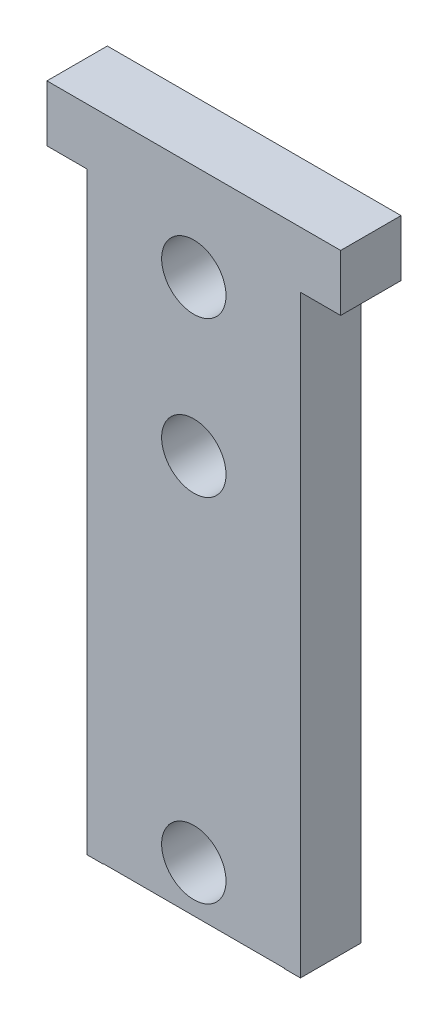
ISO-10303-21;
HEADER;
FILE_DESCRIPTION(('STEP AP214'),'2;1');
FILE_NAME('part.step','',(''),(''),'','','');
FILE_SCHEMA(('AUTOMOTIVE_DESIGN { 1 0 10303 214 1 1 1 1 }'));
ENDSEC;
DATA;
#1=APPLICATION_CONTEXT('core data for automotive mechanical design processes');
#2=APPLICATION_PROTOCOL_DEFINITION('international standard','automotive_design',2000,#1);
#3=PRODUCT_CONTEXT('',#1,'mechanical');
#4=PRODUCT('Part','Part','',(#3));
#5=PRODUCT_RELATED_PRODUCT_CATEGORY('part','',(#4));
#6=PRODUCT_DEFINITION_FORMATION('','',#4);
#7=PRODUCT_DEFINITION_CONTEXT('part definition',#1,'design');
#8=PRODUCT_DEFINITION('design','',#6,#7);
#9=PRODUCT_DEFINITION_SHAPE('','',#8);
#10=(LENGTH_UNIT() NAMED_UNIT(*) SI_UNIT(.MILLI.,.METRE.));
#11=(NAMED_UNIT(*) PLANE_ANGLE_UNIT() SI_UNIT($,.RADIAN.));
#12=(NAMED_UNIT(*) SI_UNIT($,.STERADIAN.) SOLID_ANGLE_UNIT());
#13=UNCERTAINTY_MEASURE_WITH_UNIT(LENGTH_MEASURE(1.E-05),#10,'distance_accuracy_value','');
#14=(GEOMETRIC_REPRESENTATION_CONTEXT(3) GLOBAL_UNCERTAINTY_ASSIGNED_CONTEXT((#13)) GLOBAL_UNIT_ASSIGNED_CONTEXT((#10,
#11,#12)) REPRESENTATION_CONTEXT('',''));
#15=CARTESIAN_POINT('',(0.,0.,0.));
#16=DIRECTION('',(0.,0.,1.));
#17=DIRECTION('',(1.,0.,0.));
#18=AXIS2_PLACEMENT_3D('',#15,#16,#17);
#19=CARTESIAN_POINT('',(-6.5,0.,-7.));
#20=DIRECTION('',(-1.,0.,0.));
#21=DIRECTION('',(0.,0.,1.));
#22=AXIS2_PLACEMENT_3D('',#19,#20,#21);
#23=PLANE('',#22);
#24=DIRECTION('',(0.,-1.,0.));
#25=VECTOR('',#24,1.);
#26=CARTESIAN_POINT('',(-6.5,0.,3.));
#27=LINE('',#26,#25);
#28=CARTESIAN_POINT('',(-6.5,13.2507494956604,3.));
#29=VERTEX_POINT('',#28);
#30=CARTESIAN_POINT('',(-6.5,13.25,3.));
#31=VERTEX_POINT('',#30);
#32=EDGE_CURVE('E303',#29,#31,#27,.T.);
#33=ORIENTED_EDGE('',*,*,#32,.F.);
#34=DIRECTION('',(0.,0.,1.));
#35=VECTOR('',#34,1.);
#36=CARTESIAN_POINT('',(-6.5,13.2507494956604,0.));
#37=LINE('',#36,#35);
#38=CARTESIAN_POINT('',(-6.5,13.2507494956604,0.));
#39=VERTEX_POINT('',#38);
#40=EDGE_CURVE('E223',#39,#29,#37,.T.);
#41=ORIENTED_EDGE('',*,*,#40,.F.);
#42=DIRECTION('',(0.,-1.,0.));
#43=VECTOR('',#42,1.);
#44=CARTESIAN_POINT('',(-6.5,0.,0.));
#45=LINE('',#44,#43);
#46=CARTESIAN_POINT('',(-6.5,13.25,0.));
#47=VERTEX_POINT('',#46);
#48=EDGE_CURVE('E12',#39,#47,#45,.T.);
#49=ORIENTED_EDGE('',*,*,#48,.T.);
#50=DIRECTION('',(0.,0.,1.));
#51=VECTOR('',#50,1.);
#52=CARTESIAN_POINT('',(-6.5,13.25,-7.));
#53=LINE('',#52,#51);
#54=EDGE_CURVE('E307',#47,#31,#53,.T.);
#55=ORIENTED_EDGE('',*,*,#54,.T.);
#56=EDGE_LOOP('',(#33,#41,#49,#55));
#57=FACE_BOUND('',#56,.T.);
#58=ADVANCED_FACE('F107',(#57),#23,.T.);
#59=CARTESIAN_POINT('',(0.,13.25,3.));
#60=DIRECTION('',(0.,1.,0.));
#61=DIRECTION('',(0.,0.,1.));
#62=AXIS2_PLACEMENT_3D('',#59,#60,#61);
#63=PLANE('',#62);
#64=DIRECTION('',(0.,0.,1.));
#65=VECTOR('',#64,1.);
#66=CARTESIAN_POINT('',(5.3,13.25,0.));
#67=LINE('',#66,#65);
#68=CARTESIAN_POINT('',(5.3,13.25,0.));
#69=VERTEX_POINT('',#68);
#70=CARTESIAN_POINT('',(5.3,13.25,3.));
#71=VERTEX_POINT('',#70);
#72=EDGE_CURVE('E263',#69,#71,#67,.T.);
#73=ORIENTED_EDGE('',*,*,#72,.F.);
#74=DIRECTION('',(1.,0.,0.));
#75=VECTOR('',#74,1.);
#76=CARTESIAN_POINT('',(0.,13.25,0.));
#77=LINE('',#76,#75);
#78=CARTESIAN_POINT('',(7.3,13.25,0.));
#79=VERTEX_POINT('',#78);
#80=EDGE_CURVE('E315',#69,#79,#77,.T.);
#81=ORIENTED_EDGE('',*,*,#80,.T.);
#82=DIRECTION('',(0.,0.,1.));
#83=VECTOR('',#82,1.);
#84=CARTESIAN_POINT('',(7.3,13.25,0.));
#85=LINE('',#84,#83);
#86=CARTESIAN_POINT('',(7.3,13.25,3.));
#87=VERTEX_POINT('',#86);
#88=EDGE_CURVE('E251',#79,#87,#85,.T.);
#89=ORIENTED_EDGE('',*,*,#88,.T.);
#90=DIRECTION('',(1.,0.,0.));
#91=VECTOR('',#90,1.);
#92=CARTESIAN_POINT('',(0.,13.25,3.));
#93=LINE('',#92,#91);
#94=EDGE_CURVE('E115',#71,#87,#93,.T.);
#95=ORIENTED_EDGE('',*,*,#94,.F.);
#96=EDGE_LOOP('',(#73,#81,#89,#95));
#97=FACE_BOUND('',#96,.T.);
#98=ADVANCED_FACE('F322',(#97),#63,.F.);
#99=CARTESIAN_POINT('',(0.,13.25,3.));
#100=DIRECTION('',(0.,-1.,0.));
#101=DIRECTION('',(1.,0.,0.));
#102=AXIS2_PLACEMENT_3D('',#99,#100,#101);
#103=PLANE('',#102);
#104=DIRECTION('',(0.,0.,1.));
#105=VECTOR('',#104,1.);
#106=CARTESIAN_POINT('',(-5.3,13.25,0.));
#107=LINE('',#106,#105);
#108=CARTESIAN_POINT('',(-5.3,13.25,0.));
#109=VERTEX_POINT('',#108);
#110=CARTESIAN_POINT('',(-5.3,13.25,3.));
#111=VERTEX_POINT('',#110);
#112=EDGE_CURVE('E285',#109,#111,#107,.T.);
#113=ORIENTED_EDGE('',*,*,#112,.T.);
#114=DIRECTION('',(-1.,0.,0.));
#115=VECTOR('',#114,1.);
#116=CARTESIAN_POINT('',(0.,13.25,3.));
#117=LINE('',#116,#115);
#118=EDGE_CURVE('E311',#111,#31,#117,.T.);
#119=ORIENTED_EDGE('',*,*,#118,.T.);
#120=ORIENTED_EDGE('',*,*,#54,.F.);
#121=DIRECTION('',(-1.,0.,0.));
#122=VECTOR('',#121,1.);
#123=CARTESIAN_POINT('',(0.,13.25,0.));
#124=LINE('',#123,#122);
#125=EDGE_CURVE('E310',#109,#47,#124,.T.);
#126=ORIENTED_EDGE('',*,*,#125,.F.);
#127=EDGE_LOOP('',(#113,#119,#120,#126));
#128=FACE_BOUND('',#127,.T.);
#129=ADVANCED_FACE('F109',(#128),#103,.T.);
#130=CARTESIAN_POINT('',(0.,-16.25,3.));
#131=DIRECTION('',(0.,1.,0.));
#132=DIRECTION('',(0.,0.,1.));
#133=AXIS2_PLACEMENT_3D('',#130,#131,#132);
#134=PLANE('',#133);
#135=DIRECTION('',(0.,0.,1.));
#136=VECTOR('',#135,1.);
#137=CARTESIAN_POINT('',(-4.5,-16.25,-7.));
#138=LINE('',#137,#136);
#139=CARTESIAN_POINT('',(-4.5,-16.25,0.));
#140=VERTEX_POINT('',#139);
#141=CARTESIAN_POINT('',(-4.5,-16.25,3.));
#142=VERTEX_POINT('',#141);
#143=EDGE_CURVE('E295',#140,#142,#138,.T.);
#144=ORIENTED_EDGE('',*,*,#143,.F.);
#145=DIRECTION('',(1.,0.,0.));
#146=VECTOR('',#145,1.);
#147=CARTESIAN_POINT('',(0.,-16.25,0.));
#148=LINE('',#147,#146);
#149=CARTESIAN_POINT('',(4.5,-16.25,0.));
#150=VERTEX_POINT('',#149);
#151=EDGE_CURVE('E319',#140,#150,#148,.T.);
#152=ORIENTED_EDGE('',*,*,#151,.T.);
#153=DIRECTION('',(0.,0.,1.));
#154=VECTOR('',#153,1.);
#155=CARTESIAN_POINT('',(4.5,-16.25,-7.));
#156=LINE('',#155,#154);
#157=CARTESIAN_POINT('',(4.5,-16.25,3.));
#158=VERTEX_POINT('',#157);
#159=EDGE_CURVE('E300',#150,#158,#156,.T.);
#160=ORIENTED_EDGE('',*,*,#159,.T.);
#161=DIRECTION('',(1.,0.,0.));
#162=VECTOR('',#161,1.);
#163=CARTESIAN_POINT('',(0.,-16.25,3.));
#164=LINE('',#163,#162);
#165=EDGE_CURVE('E314',#142,#158,#164,.T.);
#166=ORIENTED_EDGE('',*,*,#165,.F.);
#167=EDGE_LOOP('',(#144,#152,#160,#166));
#168=FACE_BOUND('',#167,.T.);
#169=ADVANCED_FACE('F348',(#168),#134,.F.);
#170=CARTESIAN_POINT('',(0.,0.,3.));
#171=DIRECTION('',(0.,0.,1.));
#172=DIRECTION('',(1.,0.,0.));
#173=AXIS2_PLACEMENT_3D('',#170,#171,#172);
#174=PLANE('',#173);
#175=CARTESIAN_POINT('',(0.,-13.95,3.));
#176=DIRECTION('',(0.,0.,1.));
#177=DIRECTION('',(1.,0.,0.));
#178=AXIS2_PLACEMENT_3D('',#175,#176,#177);
#179=CIRCLE('',#178,1.6);
#180=CARTESIAN_POINT('',(1.6,-13.95,3.));
#181=VERTEX_POINT('',#180);
#182=EDGE_CURVE('E539',#181,#181,#179,.T.);
#183=ORIENTED_EDGE('',*,*,#182,.F.);
#184=EDGE_LOOP('',(#183));
#185=FACE_BOUND('',#184,.T.);
#186=CARTESIAN_POINT('',(0.,11.25,3.));
#187=DIRECTION('',(0.,0.,1.));
#188=DIRECTION('',(1.,0.,0.));
#189=AXIS2_PLACEMENT_3D('',#186,#187,#188);
#190=CIRCLE('',#189,1.6);
#191=CARTESIAN_POINT('',(1.6,11.25,3.));
#192=VERTEX_POINT('',#191);
#193=EDGE_CURVE('E544',#192,#192,#190,.T.);
#194=ORIENTED_EDGE('',*,*,#193,.F.);
#195=EDGE_LOOP('',(#194));
#196=FACE_BOUND('',#195,.T.);
#197=CARTESIAN_POINT('',(0.,3.55,3.));
#198=DIRECTION('',(0.,0.,1.));
#199=DIRECTION('',(1.,0.,0.));
#200=AXIS2_PLACEMENT_3D('',#197,#198,#199);
#201=CIRCLE('',#200,1.6);
#202=CARTESIAN_POINT('',(1.6,3.55,3.));
#203=VERTEX_POINT('',#202);
#204=EDGE_CURVE('E235',#203,#203,#201,.T.);
#205=ORIENTED_EDGE('',*,*,#204,.F.);
#206=EDGE_LOOP('',(#205));
#207=FACE_BOUND('',#206,.T.);
#208=ORIENTED_EDGE('',*,*,#94,.T.);
#209=DIRECTION('',(0.,1.,0.));
#210=VECTOR('',#209,1.);
#211=CARTESIAN_POINT('',(7.3,0.,3.));
#212=LINE('',#211,#210);
#213=CARTESIAN_POINT('',(7.3,16.05,3.));
#214=VERTEX_POINT('',#213);
#215=EDGE_CURVE('E232',#87,#214,#212,.T.);
#216=ORIENTED_EDGE('',*,*,#215,.T.);
#217=DIRECTION('',(-1.,0.,0.));
#218=VECTOR('',#217,1.);
#219=CARTESIAN_POINT('',(0.,16.05,3.));
#220=LINE('',#219,#218);
#221=CARTESIAN_POINT('',(-7.3,16.05,3.));
#222=VERTEX_POINT('',#221);
#223=EDGE_CURVE('E229',#214,#222,#220,.T.);
#224=ORIENTED_EDGE('',*,*,#223,.T.);
#225=DIRECTION('',(0.,1.,0.));
#226=VECTOR('',#225,1.);
#227=CARTESIAN_POINT('',(-7.3,0.,3.));
#228=LINE('',#227,#226);
#229=CARTESIAN_POINT('',(-7.3,13.2507494956604,3.));
#230=VERTEX_POINT('',#229);
#231=EDGE_CURVE('E241',#230,#222,#228,.T.);
#232=ORIENTED_EDGE('',*,*,#231,.F.);
#233=DIRECTION('',(-1.,0.,0.));
#234=VECTOR('',#233,1.);
#235=CARTESIAN_POINT('',(0.,13.2507494956604,3.));
#236=LINE('',#235,#234);
#237=EDGE_CURVE('E122',#29,#230,#236,.T.);
#238=ORIENTED_EDGE('',*,*,#237,.F.);
#239=ORIENTED_EDGE('',*,*,#32,.T.);
#240=ORIENTED_EDGE('',*,*,#118,.F.);
#241=DIRECTION('',(0.,-1.,0.));
#242=VECTOR('',#241,1.);
#243=CARTESIAN_POINT('',(-5.3,0.,3.));
#244=LINE('',#243,#242);
#245=CARTESIAN_POINT('',(-5.3,-16.2711982076739,3.));
#246=VERTEX_POINT('',#245);
#247=EDGE_CURVE('E273',#111,#246,#244,.T.);
#248=ORIENTED_EDGE('',*,*,#247,.T.);
#249=DIRECTION('',(-1.,0.,0.));
#250=VECTOR('',#249,1.);
#251=CARTESIAN_POINT('',(0.,-16.2711982076739,3.));
#252=LINE('',#251,#250);
#253=CARTESIAN_POINT('',(-4.5,-16.2711982076739,3.));
#254=VERTEX_POINT('',#253);
#255=EDGE_CURVE('E288',#254,#246,#252,.T.);
#256=ORIENTED_EDGE('',*,*,#255,.F.);
#257=DIRECTION('',(0.,-1.,0.));
#258=VECTOR('',#257,1.);
#259=CARTESIAN_POINT('',(-4.5,0.,3.));
#260=LINE('',#259,#258);
#261=EDGE_CURVE('E281',#142,#254,#260,.T.);
#262=ORIENTED_EDGE('',*,*,#261,.F.);
#263=ORIENTED_EDGE('',*,*,#165,.T.);
#264=DIRECTION('',(0.,1.,0.));
#265=VECTOR('',#264,1.);
#266=CARTESIAN_POINT('',(4.5,0.,3.));
#267=LINE('',#266,#265);
#268=CARTESIAN_POINT('',(4.5,-16.2711982076739,3.));
#269=VERTEX_POINT('',#268);
#270=EDGE_CURVE('E266',#269,#158,#267,.T.);
#271=ORIENTED_EDGE('',*,*,#270,.F.);
#272=DIRECTION('',(1.,0.,0.));
#273=VECTOR('',#272,1.);
#274=CARTESIAN_POINT('',(0.,-16.2711982076739,3.));
#275=LINE('',#274,#273);
#276=CARTESIAN_POINT('',(5.3,-16.2711982076739,3.));
#277=VERTEX_POINT('',#276);
#278=EDGE_CURVE('E257',#269,#277,#275,.T.);
#279=ORIENTED_EDGE('',*,*,#278,.T.);
#280=DIRECTION('',(0.,-1.,0.));
#281=VECTOR('',#280,1.);
#282=CARTESIAN_POINT('',(5.3,0.,3.));
#283=LINE('',#282,#281);
#284=EDGE_CURVE('E248',#71,#277,#283,.T.);
#285=ORIENTED_EDGE('',*,*,#284,.F.);
#286=EDGE_LOOP('',(#208,#216,#224,#232,#238,#239,#240,#248,#256,#262,#263,#271,#279,#285));
#287=FACE_BOUND('',#286,.T.);
#288=ADVANCED_FACE('F330',(#185,#196,#207,#287),#174,.T.);
#289=CARTESIAN_POINT('',(0.,0.,0.));
#290=DIRECTION('',(0.,0.,1.));
#291=DIRECTION('',(1.,0.,0.));
#292=AXIS2_PLACEMENT_3D('',#289,#290,#291);
#293=PLANE('',#292);
#294=CARTESIAN_POINT('',(0.,-13.95,0.));
#295=DIRECTION('',(0.,0.,1.));
#296=DIRECTION('',(1.,0.,0.));
#297=AXIS2_PLACEMENT_3D('',#294,#295,#296);
#298=CIRCLE('',#297,1.6);
#299=CARTESIAN_POINT('',(1.6,-13.95,0.));
#300=VERTEX_POINT('',#299);
#301=EDGE_CURVE('E243',#300,#300,#298,.T.);
#302=ORIENTED_EDGE('',*,*,#301,.T.);
#303=EDGE_LOOP('',(#302));
#304=FACE_BOUND('',#303,.T.);
#305=CARTESIAN_POINT('',(0.,11.25,0.));
#306=DIRECTION('',(0.,0.,1.));
#307=DIRECTION('',(1.,0.,0.));
#308=AXIS2_PLACEMENT_3D('',#305,#306,#307);
#309=CIRCLE('',#308,1.6);
#310=CARTESIAN_POINT('',(1.6,11.25,0.));
#311=VERTEX_POINT('',#310);
#312=EDGE_CURVE('E540',#311,#311,#309,.T.);
#313=ORIENTED_EDGE('',*,*,#312,.T.);
#314=EDGE_LOOP('',(#313));
#315=FACE_BOUND('',#314,.T.);
#316=CARTESIAN_POINT('',(0.,3.55,0.));
#317=DIRECTION('',(0.,0.,1.));
#318=DIRECTION('',(1.,0.,0.));
#319=AXIS2_PLACEMENT_3D('',#316,#317,#318);
#320=CIRCLE('',#319,1.6);
#321=CARTESIAN_POINT('',(1.6,3.55,0.));
#322=VERTEX_POINT('',#321);
#323=EDGE_CURVE('E548',#322,#322,#320,.T.);
#324=ORIENTED_EDGE('',*,*,#323,.T.);
#325=EDGE_LOOP('',(#324));
#326=FACE_BOUND('',#325,.T.);
#327=DIRECTION('',(0.,1.,0.));
#328=VECTOR('',#327,1.);
#329=CARTESIAN_POINT('',(7.3,0.,0.));
#330=LINE('',#329,#328);
#331=CARTESIAN_POINT('',(7.3,16.05,0.));
#332=VERTEX_POINT('',#331);
#333=EDGE_CURVE('E216',#79,#332,#330,.T.);
#334=ORIENTED_EDGE('',*,*,#333,.F.);
#335=ORIENTED_EDGE('',*,*,#80,.F.);
#336=DIRECTION('',(0.,-1.,0.));
#337=VECTOR('',#336,1.);
#338=CARTESIAN_POINT('',(5.3,0.,0.));
#339=LINE('',#338,#337);
#340=CARTESIAN_POINT('',(5.3,-16.2711982076739,0.));
#341=VERTEX_POINT('',#340);
#342=EDGE_CURVE('E254',#69,#341,#339,.T.);
#343=ORIENTED_EDGE('',*,*,#342,.T.);
#344=DIRECTION('',(1.,0.,0.));
#345=VECTOR('',#344,1.);
#346=CARTESIAN_POINT('',(0.,-16.2711982076739,0.));
#347=LINE('',#346,#345);
#348=CARTESIAN_POINT('',(4.5,-16.2711982076739,0.));
#349=VERTEX_POINT('',#348);
#350=EDGE_CURVE('E260',#349,#341,#347,.T.);
#351=ORIENTED_EDGE('',*,*,#350,.F.);
#352=DIRECTION('',(0.,1.,0.));
#353=VECTOR('',#352,1.);
#354=CARTESIAN_POINT('',(4.5,0.,0.));
#355=LINE('',#354,#353);
#356=EDGE_CURVE('E256',#349,#150,#355,.T.);
#357=ORIENTED_EDGE('',*,*,#356,.T.);
#358=ORIENTED_EDGE('',*,*,#151,.F.);
#359=DIRECTION('',(0.,-1.,0.));
#360=VECTOR('',#359,1.);
#361=CARTESIAN_POINT('',(-4.5,0.,0.));
#362=LINE('',#361,#360);
#363=CARTESIAN_POINT('',(-4.5,-16.2711982076739,0.));
#364=VERTEX_POINT('',#363);
#365=EDGE_CURVE('E283',#140,#364,#362,.T.);
#366=ORIENTED_EDGE('',*,*,#365,.T.);
#367=DIRECTION('',(-1.,0.,0.));
#368=VECTOR('',#367,1.);
#369=CARTESIAN_POINT('',(0.,-16.2711982076739,0.));
#370=LINE('',#369,#368);
#371=CARTESIAN_POINT('',(-5.3,-16.2711982076739,0.));
#372=VERTEX_POINT('',#371);
#373=EDGE_CURVE('E280',#364,#372,#370,.T.);
#374=ORIENTED_EDGE('',*,*,#373,.T.);
#375=DIRECTION('',(0.,-1.,0.));
#376=VECTOR('',#375,1.);
#377=CARTESIAN_POINT('',(-5.3,0.,0.));
#378=LINE('',#377,#376);
#379=EDGE_CURVE('E277',#109,#372,#378,.T.);
#380=ORIENTED_EDGE('',*,*,#379,.F.);
#381=ORIENTED_EDGE('',*,*,#125,.T.);
#382=ORIENTED_EDGE('',*,*,#48,.F.);
#383=DIRECTION('',(-1.,0.,0.));
#384=VECTOR('',#383,1.);
#385=CARTESIAN_POINT('',(0.,13.2507494956604,0.));
#386=LINE('',#385,#384);
#387=CARTESIAN_POINT('',(-7.3,13.2507494956604,0.));
#388=VERTEX_POINT('',#387);
#389=EDGE_CURVE('E205',#39,#388,#386,.T.);
#390=ORIENTED_EDGE('',*,*,#389,.T.);
#391=DIRECTION('',(0.,1.,0.));
#392=VECTOR('',#391,1.);
#393=CARTESIAN_POINT('',(-7.3,0.,0.));
#394=LINE('',#393,#392);
#395=CARTESIAN_POINT('',(-7.3,16.05,0.));
#396=VERTEX_POINT('',#395);
#397=EDGE_CURVE('E211',#388,#396,#394,.T.);
#398=ORIENTED_EDGE('',*,*,#397,.T.);
#399=DIRECTION('',(-1.,0.,0.));
#400=VECTOR('',#399,1.);
#401=CARTESIAN_POINT('',(0.,16.05,0.));
#402=LINE('',#401,#400);
#403=EDGE_CURVE('E224',#332,#396,#402,.T.);
#404=ORIENTED_EDGE('',*,*,#403,.F.);
#405=EDGE_LOOP('',(#334,#335,#343,#351,#357,#358,#366,#374,#380,#381,#382,#390,#398,#404));
#406=FACE_BOUND('',#405,.T.);
#407=ADVANCED_FACE('F208',(#304,#315,#326,#406),#293,.F.);
#408=CARTESIAN_POINT('',(-4.5,0.,0.));
#409=DIRECTION('',(-1.,0.,0.));
#410=DIRECTION('',(0.,0.,1.));
#411=AXIS2_PLACEMENT_3D('',#408,#409,#410);
#412=PLANE('',#411);
#413=ORIENTED_EDGE('',*,*,#365,.F.);
#414=ORIENTED_EDGE('',*,*,#143,.T.);
#415=ORIENTED_EDGE('',*,*,#261,.T.);
#416=DIRECTION('',(0.,0.,1.));
#417=VECTOR('',#416,1.);
#418=CARTESIAN_POINT('',(-4.5,-16.2711982076739,0.));
#419=LINE('',#418,#417);
#420=EDGE_CURVE('E292',#364,#254,#419,.T.);
#421=ORIENTED_EDGE('',*,*,#420,.F.);
#422=EDGE_LOOP('',(#413,#414,#415,#421));
#423=FACE_BOUND('',#422,.T.);
#424=ADVANCED_FACE('F354',(#423),#412,.F.);
#425=CARTESIAN_POINT('',(0.,-16.2711982076739,0.));
#426=DIRECTION('',(0.,1.,0.));
#427=DIRECTION('',(0.,0.,1.));
#428=AXIS2_PLACEMENT_3D('',#425,#426,#427);
#429=PLANE('',#428);
#430=ORIENTED_EDGE('',*,*,#255,.T.);
#431=DIRECTION('',(0.,0.,1.));
#432=VECTOR('',#431,1.);
#433=CARTESIAN_POINT('',(-5.3,-16.2711982076739,0.));
#434=LINE('',#433,#432);
#435=EDGE_CURVE('E296',#372,#246,#434,.T.);
#436=ORIENTED_EDGE('',*,*,#435,.F.);
#437=ORIENTED_EDGE('',*,*,#373,.F.);
#438=ORIENTED_EDGE('',*,*,#420,.T.);
#439=EDGE_LOOP('',(#430,#436,#437,#438));
#440=FACE_BOUND('',#439,.T.);
#441=ADVANCED_FACE('F357',(#440),#429,.F.);
#442=CARTESIAN_POINT('',(-5.3,0.,0.));
#443=DIRECTION('',(-1.,0.,0.));
#444=DIRECTION('',(0.,-1.,0.));
#445=AXIS2_PLACEMENT_3D('',#442,#443,#444);
#446=PLANE('',#445);
#447=ORIENTED_EDGE('',*,*,#247,.F.);
#448=ORIENTED_EDGE('',*,*,#112,.F.);
#449=ORIENTED_EDGE('',*,*,#379,.T.);
#450=ORIENTED_EDGE('',*,*,#435,.T.);
#451=EDGE_LOOP('',(#447,#448,#449,#450));
#452=FACE_BOUND('',#451,.T.);
#453=ADVANCED_FACE('F359',(#452),#446,.T.);
#454=CARTESIAN_POINT('',(4.5,0.,0.));
#455=DIRECTION('',(1.,0.,0.));
#456=DIRECTION('',(0.,1.,0.));
#457=AXIS2_PLACEMENT_3D('',#454,#455,#456);
#458=PLANE('',#457);
#459=ORIENTED_EDGE('',*,*,#270,.T.);
#460=ORIENTED_EDGE('',*,*,#159,.F.);
#461=ORIENTED_EDGE('',*,*,#356,.F.);
#462=DIRECTION('',(0.,0.,1.));
#463=VECTOR('',#462,1.);
#464=CARTESIAN_POINT('',(4.5,-16.2711982076739,0.));
#465=LINE('',#464,#463);
#466=EDGE_CURVE('E274',#349,#269,#465,.T.);
#467=ORIENTED_EDGE('',*,*,#466,.T.);
#468=EDGE_LOOP('',(#459,#460,#461,#467));
#469=FACE_BOUND('',#468,.T.);
#470=ADVANCED_FACE('F344',(#469),#458,.F.);
#471=CARTESIAN_POINT('',(5.3,0.,0.));
#472=DIRECTION('',(-1.,0.,0.));
#473=DIRECTION('',(0.,-1.,0.));
#474=AXIS2_PLACEMENT_3D('',#471,#472,#473);
#475=PLANE('',#474);
#476=ORIENTED_EDGE('',*,*,#284,.T.);
#477=DIRECTION('',(0.,0.,1.));
#478=VECTOR('',#477,1.);
#479=CARTESIAN_POINT('',(5.3,-16.2711982076739,0.));
#480=LINE('',#479,#478);
#481=EDGE_CURVE('E271',#341,#277,#480,.T.);
#482=ORIENTED_EDGE('',*,*,#481,.F.);
#483=ORIENTED_EDGE('',*,*,#342,.F.);
#484=ORIENTED_EDGE('',*,*,#72,.T.);
#485=EDGE_LOOP('',(#476,#482,#483,#484));
#486=FACE_BOUND('',#485,.T.);
#487=ADVANCED_FACE('F336',(#486),#475,.F.);
#488=CARTESIAN_POINT('',(0.,-16.2711982076739,0.));
#489=DIRECTION('',(0.,-1.,0.));
#490=DIRECTION('',(0.,0.,-1.));
#491=AXIS2_PLACEMENT_3D('',#488,#489,#490);
#492=PLANE('',#491);
#493=ORIENTED_EDGE('',*,*,#278,.F.);
#494=ORIENTED_EDGE('',*,*,#466,.F.);
#495=ORIENTED_EDGE('',*,*,#350,.T.);
#496=ORIENTED_EDGE('',*,*,#481,.T.);
#497=EDGE_LOOP('',(#493,#494,#495,#496));
#498=FACE_BOUND('',#497,.T.);
#499=ADVANCED_FACE('F341',(#498),#492,.T.);
#500=CARTESIAN_POINT('',(-7.3,0.,0.));
#501=DIRECTION('',(1.,0.,0.));
#502=DIRECTION('',(0.,0.,-1.));
#503=AXIS2_PLACEMENT_3D('',#500,#501,#502);
#504=PLANE('',#503);
#505=ORIENTED_EDGE('',*,*,#231,.T.);
#506=DIRECTION('',(0.,0.,1.));
#507=VECTOR('',#506,1.);
#508=CARTESIAN_POINT('',(-7.3,16.05,0.));
#509=LINE('',#508,#507);
#510=EDGE_CURVE('E227',#396,#222,#509,.T.);
#511=ORIENTED_EDGE('',*,*,#510,.F.);
#512=ORIENTED_EDGE('',*,*,#397,.F.);
#513=DIRECTION('',(0.,0.,1.));
#514=VECTOR('',#513,1.);
#515=CARTESIAN_POINT('',(-7.3,13.2507494956604,0.));
#516=LINE('',#515,#514);
#517=EDGE_CURVE('E219',#388,#230,#516,.T.);
#518=ORIENTED_EDGE('',*,*,#517,.T.);
#519=EDGE_LOOP('',(#505,#511,#512,#518));
#520=FACE_BOUND('',#519,.T.);
#521=ADVANCED_FACE('F226',(#520),#504,.F.);
#522=CARTESIAN_POINT('',(0.,16.05,0.));
#523=DIRECTION('',(0.,1.,0.));
#524=DIRECTION('',(-1.,0.,0.));
#525=AXIS2_PLACEMENT_3D('',#522,#523,#524);
#526=PLANE('',#525);
#527=ORIENTED_EDGE('',*,*,#223,.F.);
#528=DIRECTION('',(0.,0.,1.));
#529=VECTOR('',#528,1.);
#530=CARTESIAN_POINT('',(7.3,16.05,0.));
#531=LINE('',#530,#529);
#532=EDGE_CURVE('E249',#332,#214,#531,.T.);
#533=ORIENTED_EDGE('',*,*,#532,.F.);
#534=ORIENTED_EDGE('',*,*,#403,.T.);
#535=ORIENTED_EDGE('',*,*,#510,.T.);
#536=EDGE_LOOP('',(#527,#533,#534,#535));
#537=FACE_BOUND('',#536,.T.);
#538=ADVANCED_FACE('F329',(#537),#526,.T.);
#539=CARTESIAN_POINT('',(7.3,0.,0.));
#540=DIRECTION('',(1.,0.,0.));
#541=DIRECTION('',(0.,0.,-1.));
#542=AXIS2_PLACEMENT_3D('',#539,#540,#541);
#543=PLANE('',#542);
#544=ORIENTED_EDGE('',*,*,#215,.F.);
#545=ORIENTED_EDGE('',*,*,#88,.F.);
#546=ORIENTED_EDGE('',*,*,#333,.T.);
#547=ORIENTED_EDGE('',*,*,#532,.T.);
#548=EDGE_LOOP('',(#544,#545,#546,#547));
#549=FACE_BOUND('',#548,.T.);
#550=ADVANCED_FACE('F326',(#549),#543,.T.);
#551=CARTESIAN_POINT('',(0.,13.2507494956604,0.));
#552=DIRECTION('',(0.,1.,0.));
#553=DIRECTION('',(0.,0.,1.));
#554=AXIS2_PLACEMENT_3D('',#551,#552,#553);
#555=PLANE('',#554);
#556=ORIENTED_EDGE('',*,*,#237,.T.);
#557=ORIENTED_EDGE('',*,*,#517,.F.);
#558=ORIENTED_EDGE('',*,*,#389,.F.);
#559=ORIENTED_EDGE('',*,*,#40,.T.);
#560=EDGE_LOOP('',(#556,#557,#558,#559));
#561=FACE_BOUND('',#560,.T.);
#562=ADVANCED_FACE('F220',(#561),#555,.F.);
#563=CARTESIAN_POINT('',(0.,3.55,0.));
#564=DIRECTION('',(0.,0.,1.));
#565=DIRECTION('',(1.,0.,0.));
#566=AXIS2_PLACEMENT_3D('',#563,#564,#565);
#567=CYLINDRICAL_SURFACE('',#566,1.6);
#568=ORIENTED_EDGE('',*,*,#323,.F.);
#569=EDGE_LOOP('',(#568));
#570=FACE_BOUND('',#569,.T.);
#571=ORIENTED_EDGE('',*,*,#204,.T.);
#572=EDGE_LOOP('',(#571));
#573=FACE_BOUND('',#572,.T.);
#574=ADVANCED_FACE('F472',(#570,#573),#567,.F.);
#575=CARTESIAN_POINT('',(0.,11.25,0.));
#576=DIRECTION('',(0.,0.,1.));
#577=DIRECTION('',(1.,0.,0.));
#578=AXIS2_PLACEMENT_3D('',#575,#576,#577);
#579=CYLINDRICAL_SURFACE('',#578,1.6);
#580=ORIENTED_EDGE('',*,*,#312,.F.);
#581=EDGE_LOOP('',(#580));
#582=FACE_BOUND('',#581,.T.);
#583=ORIENTED_EDGE('',*,*,#193,.T.);
#584=EDGE_LOOP('',(#583));
#585=FACE_BOUND('',#584,.T.);
#586=ADVANCED_FACE('F478',(#582,#585),#579,.F.);
#587=CARTESIAN_POINT('',(0.,-13.95,0.));
#588=DIRECTION('',(0.,0.,1.));
#589=DIRECTION('',(1.,0.,0.));
#590=AXIS2_PLACEMENT_3D('',#587,#588,#589);
#591=CYLINDRICAL_SURFACE('',#590,1.6);
#592=ORIENTED_EDGE('',*,*,#301,.F.);
#593=EDGE_LOOP('',(#592));
#594=FACE_BOUND('',#593,.T.);
#595=ORIENTED_EDGE('',*,*,#182,.T.);
#596=EDGE_LOOP('',(#595));
#597=FACE_BOUND('',#596,.T.);
#598=ADVANCED_FACE('F486',(#594,#597),#591,.F.);
#599=CLOSED_SHELL('',(#58,#98,#129,#169,#288,#407,#424,#441,#453,#470,#487,#499,#521,#538,#550,
#562,#574,#586,#598));
#600=MANIFOLD_SOLID_BREP('B2',#599);
#601=ADVANCED_BREP_SHAPE_REPRESENTATION('',(#18,#600),#14);
#602=SHAPE_DEFINITION_REPRESENTATION(#9,#601);
ENDSEC;
END-ISO-10303-21;
